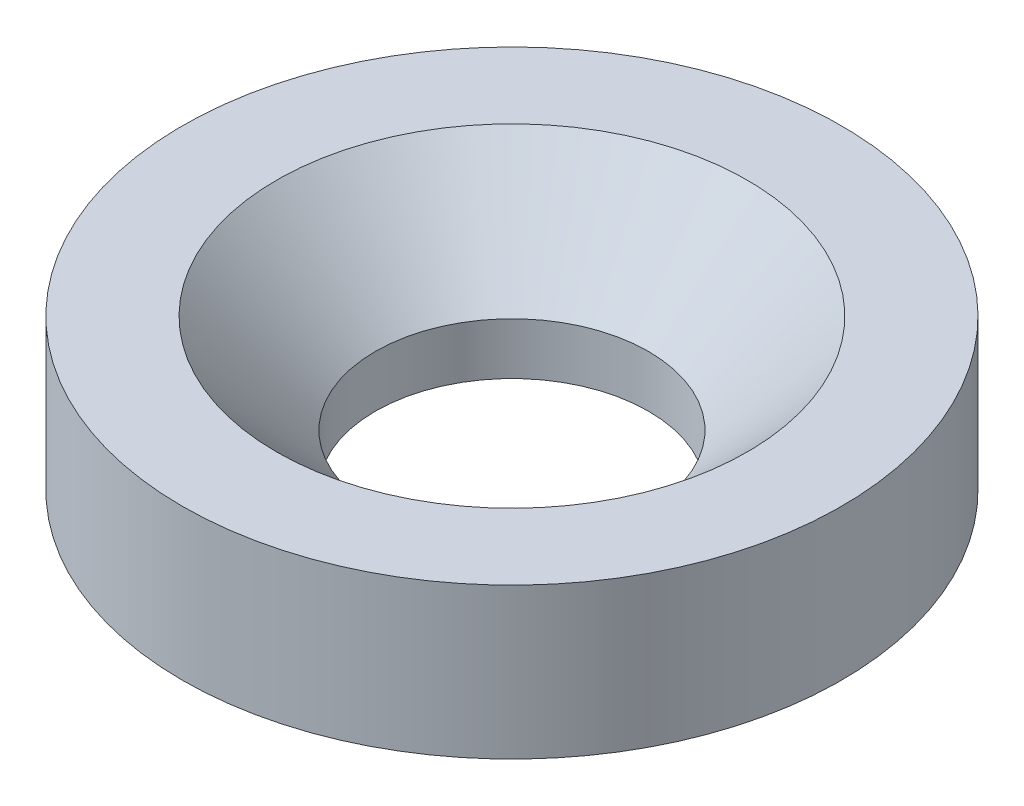
ISO-10303-21;
HEADER;
FILE_DESCRIPTION(('STEP AP214'),'2;1');
FILE_NAME('part.step','',(''),(''),'','','');
FILE_SCHEMA(('AUTOMOTIVE_DESIGN { 1 0 10303 214 1 1 1 1 }'));
ENDSEC;
DATA;
#1=APPLICATION_CONTEXT('core data for automotive mechanical design processes');
#2=APPLICATION_PROTOCOL_DEFINITION('international standard','automotive_design',2000,#1);
#3=PRODUCT_CONTEXT('',#1,'mechanical');
#4=PRODUCT('Part','Part','',(#3));
#5=PRODUCT_RELATED_PRODUCT_CATEGORY('part','',(#4));
#6=PRODUCT_DEFINITION_FORMATION('','',#4);
#7=PRODUCT_DEFINITION_CONTEXT('part definition',#1,'design');
#8=PRODUCT_DEFINITION('design','',#6,#7);
#9=PRODUCT_DEFINITION_SHAPE('','',#8);
#10=(LENGTH_UNIT() NAMED_UNIT(*) SI_UNIT(.MILLI.,.METRE.));
#11=(NAMED_UNIT(*) PLANE_ANGLE_UNIT() SI_UNIT($,.RADIAN.));
#12=(NAMED_UNIT(*) SI_UNIT($,.STERADIAN.) SOLID_ANGLE_UNIT());
#13=UNCERTAINTY_MEASURE_WITH_UNIT(LENGTH_MEASURE(1.E-05),#10,'distance_accuracy_value','');
#14=(GEOMETRIC_REPRESENTATION_CONTEXT(3) GLOBAL_UNCERTAINTY_ASSIGNED_CONTEXT((#13)) GLOBAL_UNIT_ASSIGNED_CONTEXT((#10,
#11,#12)) REPRESENTATION_CONTEXT('',''));
#15=CARTESIAN_POINT('',(0.,0.,0.));
#16=DIRECTION('',(0.,0.,1.));
#17=DIRECTION('',(1.,0.,0.));
#18=AXIS2_PLACEMENT_3D('',#15,#16,#17);
#19=CARTESIAN_POINT('',(0.,16.9920124753979,0.));
#20=DIRECTION('',(0.,1.,0.));
#21=DIRECTION('',(0.,0.,1.));
#22=AXIS2_PLACEMENT_3D('',#19,#20,#21);
#23=CYLINDRICAL_SURFACE('',#22,7.25);
#24=CARTESIAN_POINT('',(0.,0.,0.));
#25=DIRECTION('',(0.,1.,0.));
#26=DIRECTION('',(0.,0.,1.));
#27=AXIS2_PLACEMENT_3D('',#24,#25,#26);
#28=CIRCLE('',#27,7.25);
#29=CARTESIAN_POINT('',(0.,0.,7.25));
#30=VERTEX_POINT('',#29);
#31=EDGE_CURVE('E10',#30,#30,#28,.T.);
#32=ORIENTED_EDGE('',*,*,#31,.F.);
#33=EDGE_LOOP('',(#32));
#34=FACE_BOUND('',#33,.T.);
#35=CARTESIAN_POINT('',(0.,2.75000000000001,0.));
#36=DIRECTION('',(0.,1.,0.));
#37=DIRECTION('',(0.,0.,1.));
#38=AXIS2_PLACEMENT_3D('',#35,#36,#37);
#39=CIRCLE('',#38,7.25);
#40=CARTESIAN_POINT('',(0.,2.75000000000001,7.25));
#41=VERTEX_POINT('',#40);
#42=EDGE_CURVE('E54',#41,#41,#39,.T.);
#43=ORIENTED_EDGE('',*,*,#42,.T.);
#44=EDGE_LOOP('',(#43));
#45=FACE_BOUND('',#44,.T.);
#46=ADVANCED_FACE('F35',(#34,#45),#23,.F.);
#47=CARTESIAN_POINT('',(7.25,0.,0.));
#48=DIRECTION('',(0.,1.,0.));
#49=DIRECTION('',(0.,0.,1.));
#50=AXIS2_PLACEMENT_3D('',#47,#48,#49);
#51=PLANE('',#50);
#52=CARTESIAN_POINT('',(0.,0.,0.));
#53=DIRECTION('',(0.,1.,0.));
#54=DIRECTION('',(0.,0.,1.));
#55=AXIS2_PLACEMENT_3D('',#52,#53,#54);
#56=CIRCLE('',#55,17.5);
#57=CARTESIAN_POINT('',(0.,0.,17.5));
#58=VERTEX_POINT('',#57);
#59=EDGE_CURVE('E41',#58,#58,#56,.T.);
#60=ORIENTED_EDGE('',*,*,#59,.F.);
#61=EDGE_LOOP('',(#60));
#62=FACE_BOUND('',#61,.T.);
#63=ORIENTED_EDGE('',*,*,#31,.T.);
#64=EDGE_LOOP('',(#63));
#65=FACE_BOUND('',#64,.T.);
#66=ADVANCED_FACE('F73',(#62,#65),#51,.F.);
#67=CARTESIAN_POINT('',(0.,16.9920124753979,0.));
#68=DIRECTION('',(0.,1.,0.));
#69=DIRECTION('',(0.,0.,1.));
#70=AXIS2_PLACEMENT_3D('',#67,#68,#69);
#71=CYLINDRICAL_SURFACE('',#70,17.5);
#72=CARTESIAN_POINT('',(0.,8.,0.));
#73=DIRECTION('',(0.,1.,0.));
#74=DIRECTION('',(0.,0.,1.));
#75=AXIS2_PLACEMENT_3D('',#72,#73,#74);
#76=CIRCLE('',#75,17.5);
#77=CARTESIAN_POINT('',(0.,8.,17.5));
#78=VERTEX_POINT('',#77);
#79=EDGE_CURVE('E45',#78,#78,#76,.T.);
#80=ORIENTED_EDGE('',*,*,#79,.F.);
#81=EDGE_LOOP('',(#80));
#82=FACE_BOUND('',#81,.T.);
#83=ORIENTED_EDGE('',*,*,#59,.T.);
#84=EDGE_LOOP('',(#83));
#85=FACE_BOUND('',#84,.T.);
#86=ADVANCED_FACE('F68',(#82,#85),#71,.T.);
#87=CARTESIAN_POINT('',(17.5,8.,0.));
#88=DIRECTION('',(0.,-1.,0.));
#89=DIRECTION('',(0.,0.,-1.));
#90=AXIS2_PLACEMENT_3D('',#87,#88,#89);
#91=PLANE('',#90);
#92=CARTESIAN_POINT('',(0.,8.,0.));
#93=DIRECTION('',(0.,1.,0.));
#94=DIRECTION('',(0.,0.,1.));
#95=AXIS2_PLACEMENT_3D('',#92,#93,#94);
#96=CIRCLE('',#95,12.5);
#97=CARTESIAN_POINT('',(0.,8.,12.5));
#98=VERTEX_POINT('',#97);
#99=EDGE_CURVE('E49',#98,#98,#96,.T.);
#100=ORIENTED_EDGE('',*,*,#99,.F.);
#101=EDGE_LOOP('',(#100));
#102=FACE_BOUND('',#101,.T.);
#103=ORIENTED_EDGE('',*,*,#79,.T.);
#104=EDGE_LOOP('',(#103));
#105=FACE_BOUND('',#104,.T.);
#106=ADVANCED_FACE('F62',(#102,#105),#91,.F.);
#107=CARTESIAN_POINT('',(0.,8.,0.));
#108=DIRECTION('',(0.,1.,0.));
#109=DIRECTION('',(0.,0.,1.));
#110=AXIS2_PLACEMENT_3D('',#107,#108,#109);
#111=CONICAL_SURFACE('',#110,12.5,0.78539816339745);
#112=ORIENTED_EDGE('',*,*,#42,.F.);
#113=EDGE_LOOP('',(#112));
#114=FACE_BOUND('',#113,.T.);
#115=ORIENTED_EDGE('',*,*,#99,.T.);
#116=EDGE_LOOP('',(#115));
#117=FACE_BOUND('',#116,.T.);
#118=ADVANCED_FACE('F59',(#114,#117),#111,.F.);
#119=CLOSED_SHELL('',(#46,#66,#86,#106,#118));
#120=MANIFOLD_SOLID_BREP('B2',#119);
#121=ADVANCED_BREP_SHAPE_REPRESENTATION('',(#18,#120),#14);
#122=SHAPE_DEFINITION_REPRESENTATION(#9,#121);
ENDSEC;
END-ISO-10303-21;
